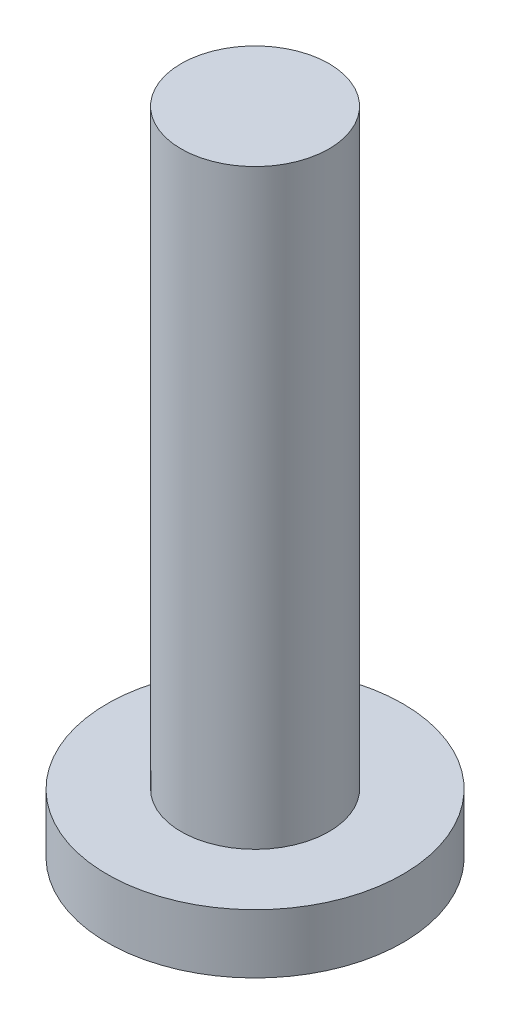
ISO-10303-21;
HEADER;
FILE_DESCRIPTION(('STEP AP214'),'2;1');
FILE_NAME('part.step','',(''),(''),'','','');
FILE_SCHEMA(('AUTOMOTIVE_DESIGN { 1 0 10303 214 1 1 1 1 }'));
ENDSEC;
DATA;
#1=APPLICATION_CONTEXT('core data for automotive mechanical design processes');
#2=APPLICATION_PROTOCOL_DEFINITION('international standard','automotive_design',2000,#1);
#3=PRODUCT_CONTEXT('',#1,'mechanical');
#4=PRODUCT('Part','Part','',(#3));
#5=PRODUCT_RELATED_PRODUCT_CATEGORY('part','',(#4));
#6=PRODUCT_DEFINITION_FORMATION('','',#4);
#7=PRODUCT_DEFINITION_CONTEXT('part definition',#1,'design');
#8=PRODUCT_DEFINITION('design','',#6,#7);
#9=PRODUCT_DEFINITION_SHAPE('','',#8);
#10=(LENGTH_UNIT() NAMED_UNIT(*) SI_UNIT(.MILLI.,.METRE.));
#11=(NAMED_UNIT(*) PLANE_ANGLE_UNIT() SI_UNIT($,.RADIAN.));
#12=(NAMED_UNIT(*) SI_UNIT($,.STERADIAN.) SOLID_ANGLE_UNIT());
#13=UNCERTAINTY_MEASURE_WITH_UNIT(LENGTH_MEASURE(1.E-05),#10,'distance_accuracy_value','');
#14=(GEOMETRIC_REPRESENTATION_CONTEXT(3) GLOBAL_UNCERTAINTY_ASSIGNED_CONTEXT((#13)) GLOBAL_UNIT_ASSIGNED_CONTEXT((#10,
#11,#12)) REPRESENTATION_CONTEXT('',''));
#15=CARTESIAN_POINT('',(0.,0.,0.));
#16=DIRECTION('',(0.,0.,1.));
#17=DIRECTION('',(1.,0.,0.));
#18=AXIS2_PLACEMENT_3D('',#15,#16,#17);
#19=CARTESIAN_POINT('',(0.,10.,0.));
#20=DIRECTION('',(0.,-1.,0.));
#21=DIRECTION('',(0.,0.,-1.));
#22=AXIS2_PLACEMENT_3D('',#19,#20,#21);
#23=CYLINDRICAL_SURFACE('',#22,1.25);
#24=CARTESIAN_POINT('',(0.,10.,0.));
#25=DIRECTION('',(0.,1.,0.));
#26=DIRECTION('',(0.,0.,1.));
#27=AXIS2_PLACEMENT_3D('',#24,#25,#26);
#28=CIRCLE('',#27,1.25);
#29=CARTESIAN_POINT('',(0.,10.,1.25));
#30=VERTEX_POINT('',#29);
#31=EDGE_CURVE('E10',#30,#30,#28,.T.);
#32=ORIENTED_EDGE('',*,*,#31,.F.);
#33=EDGE_LOOP('',(#32));
#34=FACE_BOUND('',#33,.T.);
#35=CARTESIAN_POINT('',(0.,0.,0.));
#36=DIRECTION('',(0.,-1.,0.));
#37=DIRECTION('',(0.,0.,-1.));
#38=AXIS2_PLACEMENT_3D('',#35,#36,#37);
#39=CIRCLE('',#38,1.25);
#40=CARTESIAN_POINT('',(0.,0.,-1.25));
#41=VERTEX_POINT('',#40);
#42=EDGE_CURVE('E39',#41,#41,#39,.T.);
#43=ORIENTED_EDGE('',*,*,#42,.F.);
#44=EDGE_LOOP('',(#43));
#45=FACE_BOUND('',#44,.T.);
#46=ADVANCED_FACE('F33',(#34,#45),#23,.T.);
#47=CARTESIAN_POINT('',(0.,10.,0.));
#48=DIRECTION('',(0.,1.,0.));
#49=DIRECTION('',(0.,0.,1.));
#50=AXIS2_PLACEMENT_3D('',#47,#48,#49);
#51=PLANE('',#50);
#52=ORIENTED_EDGE('',*,*,#31,.T.);
#53=EDGE_LOOP('',(#52));
#54=FACE_BOUND('',#53,.T.);
#55=ADVANCED_FACE('F66',(#54),#51,.T.);
#56=CARTESIAN_POINT('',(0.,-1.,0.));
#57=DIRECTION('',(0.,1.,0.));
#58=DIRECTION('',(0.,0.,1.));
#59=AXIS2_PLACEMENT_3D('',#56,#57,#58);
#60=CYLINDRICAL_SURFACE('',#59,2.5);
#61=CARTESIAN_POINT('',(0.,-1.,0.));
#62=DIRECTION('',(0.,-1.,0.));
#63=DIRECTION('',(0.,0.,-1.));
#64=AXIS2_PLACEMENT_3D('',#61,#62,#63);
#65=CIRCLE('',#64,2.5);
#66=CARTESIAN_POINT('',(0.,-1.,-2.5));
#67=VERTEX_POINT('',#66);
#68=EDGE_CURVE('E43',#67,#67,#65,.T.);
#69=ORIENTED_EDGE('',*,*,#68,.F.);
#70=EDGE_LOOP('',(#69));
#71=FACE_BOUND('',#70,.T.);
#72=CARTESIAN_POINT('',(0.,0.,0.));
#73=DIRECTION('',(0.,-1.,0.));
#74=DIRECTION('',(0.,0.,-1.));
#75=AXIS2_PLACEMENT_3D('',#72,#73,#74);
#76=CIRCLE('',#75,2.5);
#77=CARTESIAN_POINT('',(0.,0.,-2.5));
#78=VERTEX_POINT('',#77);
#79=EDGE_CURVE('E47',#78,#78,#76,.T.);
#80=ORIENTED_EDGE('',*,*,#79,.T.);
#81=EDGE_LOOP('',(#80));
#82=FACE_BOUND('',#81,.T.);
#83=ADVANCED_FACE('F53',(#71,#82),#60,.T.);
#84=CARTESIAN_POINT('',(0.,-1.,0.));
#85=DIRECTION('',(0.,-1.,0.));
#86=DIRECTION('',(0.,0.,-1.));
#87=AXIS2_PLACEMENT_3D('',#84,#85,#86);
#88=PLANE('',#87);
#89=ORIENTED_EDGE('',*,*,#68,.T.);
#90=EDGE_LOOP('',(#89));
#91=FACE_BOUND('',#90,.T.);
#92=ADVANCED_FACE('F57',(#91),#88,.T.);
#93=CARTESIAN_POINT('',(0.,0.,0.));
#94=DIRECTION('',(0.,-1.,0.));
#95=DIRECTION('',(0.,0.,-1.));
#96=AXIS2_PLACEMENT_3D('',#93,#94,#95);
#97=PLANE('',#96);
#98=ORIENTED_EDGE('',*,*,#42,.T.);
#99=EDGE_LOOP('',(#98));
#100=FACE_BOUND('',#99,.T.);
#101=ORIENTED_EDGE('',*,*,#79,.F.);
#102=EDGE_LOOP('',(#101));
#103=FACE_BOUND('',#102,.T.);
#104=ADVANCED_FACE('F55',(#100,#103),#97,.F.);
#105=CLOSED_SHELL('',(#46,#55,#83,#92,#104));
#106=MANIFOLD_SOLID_BREP('B2',#105);
#107=ADVANCED_BREP_SHAPE_REPRESENTATION('',(#18,#106),#14);
#108=SHAPE_DEFINITION_REPRESENTATION(#9,#107);
ENDSEC;
END-ISO-10303-21;
